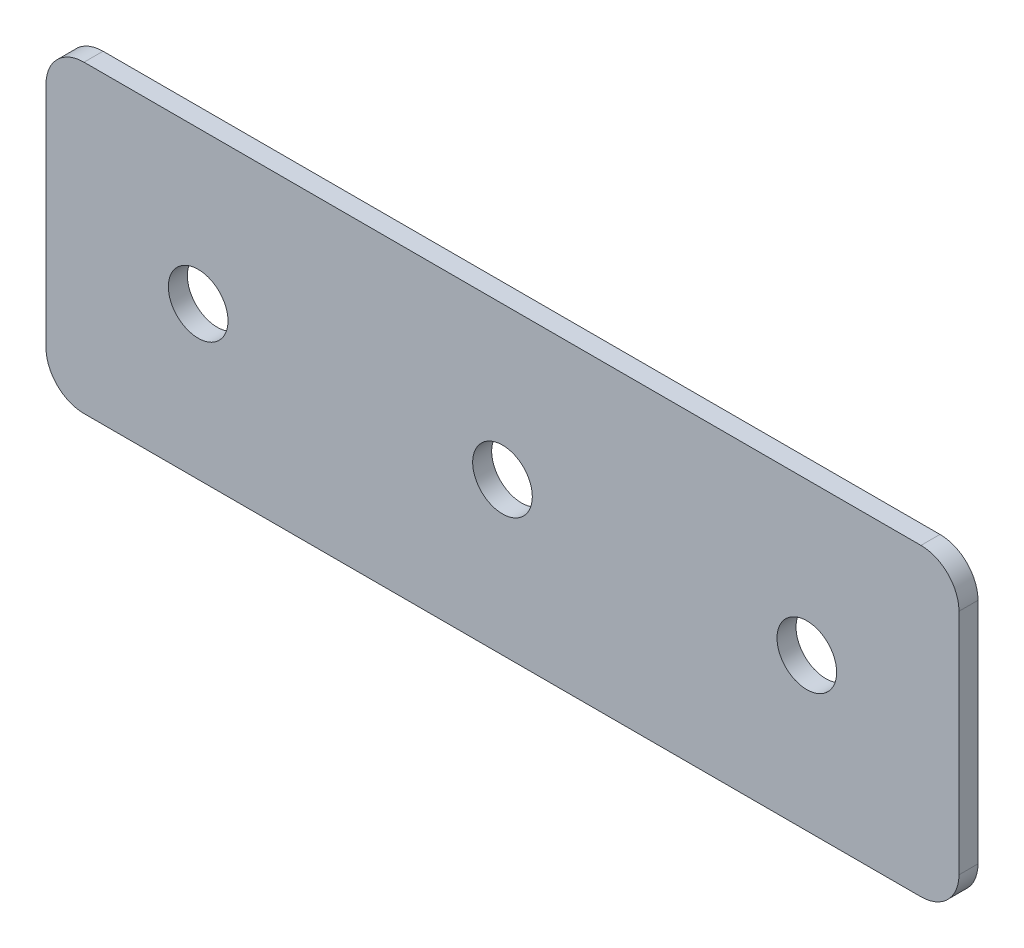
ISO-10303-21;
HEADER;
FILE_DESCRIPTION(('STEP AP214'),'2;1');
FILE_NAME('part.step','',(''),(''),'','','');
FILE_SCHEMA(('AUTOMOTIVE_DESIGN { 1 0 10303 214 1 1 1 1 }'));
ENDSEC;
DATA;
#1=APPLICATION_CONTEXT('core data for automotive mechanical design processes');
#2=APPLICATION_PROTOCOL_DEFINITION('international standard','automotive_design',2000,#1);
#3=PRODUCT_CONTEXT('',#1,'mechanical');
#4=PRODUCT('Part','Part','',(#3));
#5=PRODUCT_RELATED_PRODUCT_CATEGORY('part','',(#4));
#6=PRODUCT_DEFINITION_FORMATION('','',#4);
#7=PRODUCT_DEFINITION_CONTEXT('part definition',#1,'design');
#8=PRODUCT_DEFINITION('design','',#6,#7);
#9=PRODUCT_DEFINITION_SHAPE('','',#8);
#10=(LENGTH_UNIT() NAMED_UNIT(*) SI_UNIT(.MILLI.,.METRE.));
#11=(NAMED_UNIT(*) PLANE_ANGLE_UNIT() SI_UNIT($,.RADIAN.));
#12=(NAMED_UNIT(*) SI_UNIT($,.STERADIAN.) SOLID_ANGLE_UNIT());
#13=UNCERTAINTY_MEASURE_WITH_UNIT(LENGTH_MEASURE(1.E-05),#10,'distance_accuracy_value','');
#14=(GEOMETRIC_REPRESENTATION_CONTEXT(3) GLOBAL_UNCERTAINTY_ASSIGNED_CONTEXT((#13)) GLOBAL_UNIT_ASSIGNED_CONTEXT((#10,
#11,#12)) REPRESENTATION_CONTEXT('',''));
#15=CARTESIAN_POINT('',(0.,0.,0.));
#16=DIRECTION('',(0.,0.,1.));
#17=DIRECTION('',(1.,0.,0.));
#18=AXIS2_PLACEMENT_3D('',#15,#16,#17);
#19=CARTESIAN_POINT('',(0.,0.,-1.5875));
#20=DIRECTION('',(-1.,0.,0.));
#21=DIRECTION('',(0.,0.,1.));
#22=AXIS2_PLACEMENT_3D('',#19,#20,#21);
#23=PLANE('',#22);
#24=DIRECTION('',(0.,-1.,0.));
#25=VECTOR('',#24,1.);
#26=CARTESIAN_POINT('',(0.,0.,-1.5875));
#27=LINE('',#26,#25);
#28=CARTESIAN_POINT('',(0.,22.225,-1.5875));
#29=VERTEX_POINT('',#28);
#30=CARTESIAN_POINT('',(0.,3.175,-1.5875));
#31=VERTEX_POINT('',#30);
#32=EDGE_CURVE('E173',#29,#31,#27,.T.);
#33=ORIENTED_EDGE('',*,*,#32,.T.);
#34=DIRECTION('',(0.,0.,1.));
#35=VECTOR('',#34,1.);
#36=CARTESIAN_POINT('',(0.,3.175,-1.5875));
#37=LINE('',#36,#35);
#38=CARTESIAN_POINT('',(0.,3.175,0.));
#39=VERTEX_POINT('',#38);
#40=EDGE_CURVE('E120',#31,#39,#37,.T.);
#41=ORIENTED_EDGE('',*,*,#40,.T.);
#42=DIRECTION('',(0.,-1.,0.));
#43=VECTOR('',#42,1.);
#44=CARTESIAN_POINT('',(0.,0.,0.));
#45=LINE('',#44,#43);
#46=CARTESIAN_POINT('',(0.,22.225,0.));
#47=VERTEX_POINT('',#46);
#48=EDGE_CURVE('E112',#47,#39,#45,.T.);
#49=ORIENTED_EDGE('',*,*,#48,.F.);
#50=DIRECTION('',(0.,0.,1.));
#51=VECTOR('',#50,1.);
#52=CARTESIAN_POINT('',(0.,22.225,-1.5875));
#53=LINE('',#52,#51);
#54=EDGE_CURVE('E125',#47,#29,#53,.F.);
#55=ORIENTED_EDGE('',*,*,#54,.T.);
#56=EDGE_LOOP('',(#33,#41,#49,#55));
#57=FACE_BOUND('',#56,.T.);
#58=ADVANCED_FACE('F43',(#57),#23,.T.);
#59=CARTESIAN_POINT('',(0.,25.4,-1.5875));
#60=DIRECTION('',(0.,1.,0.));
#61=DIRECTION('',(0.,0.,1.));
#62=AXIS2_PLACEMENT_3D('',#59,#60,#61);
#63=PLANE('',#62);
#64=DIRECTION('',(-1.,0.,0.));
#65=VECTOR('',#64,1.);
#66=CARTESIAN_POINT('',(0.,25.4,0.));
#67=LINE('',#66,#65);
#68=CARTESIAN_POINT('',(73.025,25.4,0.));
#69=VERTEX_POINT('',#68);
#70=CARTESIAN_POINT('',(3.175,25.4,0.));
#71=VERTEX_POINT('',#70);
#72=EDGE_CURVE('E114',#69,#71,#67,.T.);
#73=ORIENTED_EDGE('',*,*,#72,.F.);
#74=DIRECTION('',(0.,0.,1.));
#75=VECTOR('',#74,1.);
#76=CARTESIAN_POINT('',(73.025,25.4,-1.5875));
#77=LINE('',#76,#75);
#78=CARTESIAN_POINT('',(73.025,25.4,-1.5875));
#79=VERTEX_POINT('',#78);
#80=EDGE_CURVE('E11',#69,#79,#77,.F.);
#81=ORIENTED_EDGE('',*,*,#80,.T.);
#82=DIRECTION('',(-1.,0.,0.));
#83=VECTOR('',#82,1.);
#84=CARTESIAN_POINT('',(0.,25.4,-1.5875));
#85=LINE('',#84,#83);
#86=CARTESIAN_POINT('',(3.175,25.4,-1.5875));
#87=VERTEX_POINT('',#86);
#88=EDGE_CURVE('E133',#79,#87,#85,.T.);
#89=ORIENTED_EDGE('',*,*,#88,.T.);
#90=DIRECTION('',(0.,0.,1.));
#91=VECTOR('',#90,1.);
#92=CARTESIAN_POINT('',(3.175,25.4,-1.5875));
#93=LINE('',#92,#91);
#94=EDGE_CURVE('E51',#87,#71,#93,.T.);
#95=ORIENTED_EDGE('',*,*,#94,.T.);
#96=EDGE_LOOP('',(#73,#81,#89,#95));
#97=FACE_BOUND('',#96,.T.);
#98=ADVANCED_FACE('F162',(#97),#63,.T.);
#99=CARTESIAN_POINT('',(76.2,0.,-1.5875));
#100=DIRECTION('',(1.,0.,0.));
#101=DIRECTION('',(0.,0.,-1.));
#102=AXIS2_PLACEMENT_3D('',#99,#100,#101);
#103=PLANE('',#102);
#104=DIRECTION('',(0.,1.,0.));
#105=VECTOR('',#104,1.);
#106=CARTESIAN_POINT('',(76.2,0.,0.));
#107=LINE('',#106,#105);
#108=CARTESIAN_POINT('',(76.2,3.175,0.));
#109=VERTEX_POINT('',#108);
#110=CARTESIAN_POINT('',(76.2,22.225,0.));
#111=VERTEX_POINT('',#110);
#112=EDGE_CURVE('E171',#109,#111,#107,.T.);
#113=ORIENTED_EDGE('',*,*,#112,.F.);
#114=DIRECTION('',(0.,0.,1.));
#115=VECTOR('',#114,1.);
#116=CARTESIAN_POINT('',(76.2,3.175,-1.5875));
#117=LINE('',#116,#115);
#118=CARTESIAN_POINT('',(76.2,3.175,-1.5875));
#119=VERTEX_POINT('',#118);
#120=EDGE_CURVE('E65',#109,#119,#117,.F.);
#121=ORIENTED_EDGE('',*,*,#120,.T.);
#122=DIRECTION('',(0.,1.,0.));
#123=VECTOR('',#122,1.);
#124=CARTESIAN_POINT('',(76.2,0.,-1.5875));
#125=LINE('',#124,#123);
#126=CARTESIAN_POINT('',(76.2,22.225,-1.5875));
#127=VERTEX_POINT('',#126);
#128=EDGE_CURVE('E137',#119,#127,#125,.T.);
#129=ORIENTED_EDGE('',*,*,#128,.T.);
#130=DIRECTION('',(0.,0.,1.));
#131=VECTOR('',#130,1.);
#132=CARTESIAN_POINT('',(76.2,22.225,-1.5875));
#133=LINE('',#132,#131);
#134=EDGE_CURVE('E158',#127,#111,#133,.T.);
#135=ORIENTED_EDGE('',*,*,#134,.T.);
#136=EDGE_LOOP('',(#113,#121,#129,#135));
#137=FACE_BOUND('',#136,.T.);
#138=ADVANCED_FACE('F170',(#137),#103,.T.);
#139=CARTESIAN_POINT('',(0.,0.,-1.5875));
#140=DIRECTION('',(0.,-1.,0.));
#141=DIRECTION('',(0.,0.,-1.));
#142=AXIS2_PLACEMENT_3D('',#139,#140,#141);
#143=PLANE('',#142);
#144=DIRECTION('',(1.,0.,0.));
#145=VECTOR('',#144,1.);
#146=CARTESIAN_POINT('',(0.,0.,0.));
#147=LINE('',#146,#145);
#148=CARTESIAN_POINT('',(3.175,0.,0.));
#149=VERTEX_POINT('',#148);
#150=CARTESIAN_POINT('',(73.025,0.,0.));
#151=VERTEX_POINT('',#150);
#152=EDGE_CURVE('E128',#149,#151,#147,.T.);
#153=ORIENTED_EDGE('',*,*,#152,.F.);
#154=DIRECTION('',(0.,0.,1.));
#155=VECTOR('',#154,1.);
#156=CARTESIAN_POINT('',(3.175,0.,-1.5875));
#157=LINE('',#156,#155);
#158=CARTESIAN_POINT('',(3.175,0.,-1.5875));
#159=VERTEX_POINT('',#158);
#160=EDGE_CURVE('E150',#149,#159,#157,.F.);
#161=ORIENTED_EDGE('',*,*,#160,.T.);
#162=DIRECTION('',(1.,0.,0.));
#163=VECTOR('',#162,1.);
#164=CARTESIAN_POINT('',(0.,0.,-1.5875));
#165=LINE('',#164,#163);
#166=CARTESIAN_POINT('',(73.025,0.,-1.5875));
#167=VERTEX_POINT('',#166);
#168=EDGE_CURVE('E177',#159,#167,#165,.T.);
#169=ORIENTED_EDGE('',*,*,#168,.T.);
#170=DIRECTION('',(0.,0.,1.));
#171=VECTOR('',#170,1.);
#172=CARTESIAN_POINT('',(73.025,0.,-1.5875));
#173=LINE('',#172,#171);
#174=EDGE_CURVE('E147',#167,#151,#173,.T.);
#175=ORIENTED_EDGE('',*,*,#174,.T.);
#176=EDGE_LOOP('',(#153,#161,#169,#175));
#177=FACE_BOUND('',#176,.T.);
#178=ADVANCED_FACE('F235',(#177),#143,.T.);
#179=CARTESIAN_POINT('',(0.,0.,-1.5875));
#180=DIRECTION('',(0.,0.,-1.));
#181=DIRECTION('',(-1.,0.,0.));
#182=AXIS2_PLACEMENT_3D('',#179,#180,#181);
#183=PLANE('',#182);
#184=CARTESIAN_POINT('',(12.7,12.7,-1.5875));
#185=DIRECTION('',(0.,0.,1.));
#186=DIRECTION('',(1.,0.,0.));
#187=AXIS2_PLACEMENT_3D('',#184,#185,#186);
#188=CIRCLE('',#187,2.4892);
#189=CARTESIAN_POINT('',(15.1892,12.7,-1.5875));
#190=VERTEX_POINT('',#189);
#191=EDGE_CURVE('E129',#190,#190,#188,.T.);
#192=ORIENTED_EDGE('',*,*,#191,.T.);
#193=EDGE_LOOP('',(#192));
#194=FACE_BOUND('',#193,.T.);
#195=CARTESIAN_POINT('',(38.1,12.7,-1.5875));
#196=DIRECTION('',(0.,0.,1.));
#197=DIRECTION('',(1.,0.,0.));
#198=AXIS2_PLACEMENT_3D('',#195,#196,#197);
#199=CIRCLE('',#198,2.4892);
#200=CARTESIAN_POINT('',(40.5892,12.7,-1.5875));
#201=VERTEX_POINT('',#200);
#202=EDGE_CURVE('E187',#201,#201,#199,.T.);
#203=ORIENTED_EDGE('',*,*,#202,.T.);
#204=EDGE_LOOP('',(#203));
#205=FACE_BOUND('',#204,.T.);
#206=CARTESIAN_POINT('',(63.5,12.7,-1.5875));
#207=DIRECTION('',(0.,0.,1.));
#208=DIRECTION('',(1.,0.,0.));
#209=AXIS2_PLACEMENT_3D('',#206,#207,#208);
#210=CIRCLE('',#209,2.4892);
#211=CARTESIAN_POINT('',(65.9892,12.7,-1.5875));
#212=VERTEX_POINT('',#211);
#213=EDGE_CURVE('E181',#212,#212,#210,.T.);
#214=ORIENTED_EDGE('',*,*,#213,.T.);
#215=EDGE_LOOP('',(#214));
#216=FACE_BOUND('',#215,.T.);
#217=ORIENTED_EDGE('',*,*,#168,.F.);
#218=CARTESIAN_POINT('',(3.175,3.175,-1.5875));
#219=DIRECTION('',(0.,0.,-1.));
#220=DIRECTION('',(-1.,0.,0.));
#221=AXIS2_PLACEMENT_3D('',#218,#219,#220);
#222=CIRCLE('',#221,3.175);
#223=EDGE_CURVE('E156',#159,#31,#222,.T.);
#224=ORIENTED_EDGE('',*,*,#223,.T.);
#225=ORIENTED_EDGE('',*,*,#32,.F.);
#226=CARTESIAN_POINT('',(3.175,22.225,-1.5875));
#227=DIRECTION('',(0.,0.,-1.));
#228=DIRECTION('',(-1.,0.,0.));
#229=AXIS2_PLACEMENT_3D('',#226,#227,#228);
#230=CIRCLE('',#229,3.175);
#231=EDGE_CURVE('E132',#29,#87,#230,.T.);
#232=ORIENTED_EDGE('',*,*,#231,.T.);
#233=ORIENTED_EDGE('',*,*,#88,.F.);
#234=CARTESIAN_POINT('',(73.025,22.225,-1.5875));
#235=DIRECTION('',(0.,0.,-1.));
#236=DIRECTION('',(-1.,0.,0.));
#237=AXIS2_PLACEMENT_3D('',#234,#235,#236);
#238=CIRCLE('',#237,3.175);
#239=EDGE_CURVE('E58',#79,#127,#238,.T.);
#240=ORIENTED_EDGE('',*,*,#239,.T.);
#241=ORIENTED_EDGE('',*,*,#128,.F.);
#242=CARTESIAN_POINT('',(73.025,3.175,-1.5875));
#243=DIRECTION('',(0.,0.,-1.));
#244=DIRECTION('',(-1.,0.,0.));
#245=AXIS2_PLACEMENT_3D('',#242,#243,#244);
#246=CIRCLE('',#245,3.175);
#247=EDGE_CURVE('E154',#119,#167,#246,.T.);
#248=ORIENTED_EDGE('',*,*,#247,.T.);
#249=EDGE_LOOP('',(#217,#224,#225,#232,#233,#240,#241,#248));
#250=FACE_BOUND('',#249,.T.);
#251=ADVANCED_FACE('F165',(#194,#205,#216,#250),#183,.T.);
#252=CARTESIAN_POINT('',(0.,0.,0.));
#253=DIRECTION('',(0.,0.,-1.));
#254=DIRECTION('',(-1.,0.,0.));
#255=AXIS2_PLACEMENT_3D('',#252,#253,#254);
#256=PLANE('',#255);
#257=CARTESIAN_POINT('',(12.7,12.7,0.));
#258=DIRECTION('',(0.,0.,1.));
#259=DIRECTION('',(1.,0.,0.));
#260=AXIS2_PLACEMENT_3D('',#257,#258,#259);
#261=CIRCLE('',#260,2.4892);
#262=CARTESIAN_POINT('',(15.1892,12.7,0.));
#263=VERTEX_POINT('',#262);
#264=EDGE_CURVE('E193',#263,#263,#261,.T.);
#265=ORIENTED_EDGE('',*,*,#264,.F.);
#266=EDGE_LOOP('',(#265));
#267=FACE_BOUND('',#266,.T.);
#268=CARTESIAN_POINT('',(38.1,12.7,0.));
#269=DIRECTION('',(0.,0.,1.));
#270=DIRECTION('',(1.,0.,0.));
#271=AXIS2_PLACEMENT_3D('',#268,#269,#270);
#272=CIRCLE('',#271,2.4892);
#273=CARTESIAN_POINT('',(40.5892,12.7,0.));
#274=VERTEX_POINT('',#273);
#275=EDGE_CURVE('E190',#274,#274,#272,.T.);
#276=ORIENTED_EDGE('',*,*,#275,.F.);
#277=EDGE_LOOP('',(#276));
#278=FACE_BOUND('',#277,.T.);
#279=CARTESIAN_POINT('',(63.5,12.7,0.));
#280=DIRECTION('',(0.,0.,1.));
#281=DIRECTION('',(1.,0.,0.));
#282=AXIS2_PLACEMENT_3D('',#279,#280,#281);
#283=CIRCLE('',#282,2.4892);
#284=CARTESIAN_POINT('',(65.9892,12.7,0.));
#285=VERTEX_POINT('',#284);
#286=EDGE_CURVE('E184',#285,#285,#283,.T.);
#287=ORIENTED_EDGE('',*,*,#286,.F.);
#288=EDGE_LOOP('',(#287));
#289=FACE_BOUND('',#288,.T.);
#290=ORIENTED_EDGE('',*,*,#48,.T.);
#291=CARTESIAN_POINT('',(3.175,3.175,0.));
#292=DIRECTION('',(0.,0.,-1.));
#293=DIRECTION('',(-1.,0.,0.));
#294=AXIS2_PLACEMENT_3D('',#291,#292,#293);
#295=CIRCLE('',#294,3.175);
#296=EDGE_CURVE('E145',#39,#149,#295,.F.);
#297=ORIENTED_EDGE('',*,*,#296,.T.);
#298=ORIENTED_EDGE('',*,*,#152,.T.);
#299=CARTESIAN_POINT('',(73.025,3.175,0.));
#300=DIRECTION('',(0.,0.,-1.));
#301=DIRECTION('',(-1.,0.,0.));
#302=AXIS2_PLACEMENT_3D('',#299,#300,#301);
#303=CIRCLE('',#302,3.175);
#304=EDGE_CURVE('E143',#151,#109,#303,.F.);
#305=ORIENTED_EDGE('',*,*,#304,.T.);
#306=ORIENTED_EDGE('',*,*,#112,.T.);
#307=CARTESIAN_POINT('',(73.025,22.225,0.));
#308=DIRECTION('',(0.,0.,-1.));
#309=DIRECTION('',(-1.,0.,0.));
#310=AXIS2_PLACEMENT_3D('',#307,#308,#309);
#311=CIRCLE('',#310,3.175);
#312=EDGE_CURVE('E119',#111,#69,#311,.F.);
#313=ORIENTED_EDGE('',*,*,#312,.T.);
#314=ORIENTED_EDGE('',*,*,#72,.T.);
#315=CARTESIAN_POINT('',(3.175,22.225,0.));
#316=DIRECTION('',(0.,0.,-1.));
#317=DIRECTION('',(-1.,0.,0.));
#318=AXIS2_PLACEMENT_3D('',#315,#316,#317);
#319=CIRCLE('',#318,3.175);
#320=EDGE_CURVE('E109',#71,#47,#319,.F.);
#321=ORIENTED_EDGE('',*,*,#320,.T.);
#322=EDGE_LOOP('',(#290,#297,#298,#305,#306,#313,#314,#321));
#323=FACE_BOUND('',#322,.T.);
#324=ADVANCED_FACE('F111',(#267,#278,#289,#323),#256,.F.);
#325=CARTESIAN_POINT('',(63.5,12.7,-1.5875));
#326=DIRECTION('',(0.,0.,1.));
#327=DIRECTION('',(1.,0.,0.));
#328=AXIS2_PLACEMENT_3D('',#325,#326,#327);
#329=CYLINDRICAL_SURFACE('',#328,2.4892);
#330=ORIENTED_EDGE('',*,*,#213,.F.);
#331=EDGE_LOOP('',(#330));
#332=FACE_BOUND('',#331,.T.);
#333=ORIENTED_EDGE('',*,*,#286,.T.);
#334=EDGE_LOOP('',(#333));
#335=FACE_BOUND('',#334,.T.);
#336=ADVANCED_FACE('F211',(#332,#335),#329,.F.);
#337=CARTESIAN_POINT('',(38.1,12.7,-1.5875));
#338=DIRECTION('',(0.,0.,1.));
#339=DIRECTION('',(1.,0.,0.));
#340=AXIS2_PLACEMENT_3D('',#337,#338,#339);
#341=CYLINDRICAL_SURFACE('',#340,2.4892);
#342=ORIENTED_EDGE('',*,*,#202,.F.);
#343=EDGE_LOOP('',(#342));
#344=FACE_BOUND('',#343,.T.);
#345=ORIENTED_EDGE('',*,*,#275,.T.);
#346=EDGE_LOOP('',(#345));
#347=FACE_BOUND('',#346,.T.);
#348=ADVANCED_FACE('F205',(#344,#347),#341,.F.);
#349=CARTESIAN_POINT('',(12.7,12.7,-1.5875));
#350=DIRECTION('',(0.,0.,1.));
#351=DIRECTION('',(1.,0.,0.));
#352=AXIS2_PLACEMENT_3D('',#349,#350,#351);
#353=CYLINDRICAL_SURFACE('',#352,2.4892);
#354=ORIENTED_EDGE('',*,*,#191,.F.);
#355=EDGE_LOOP('',(#354));
#356=FACE_BOUND('',#355,.T.);
#357=ORIENTED_EDGE('',*,*,#264,.T.);
#358=EDGE_LOOP('',(#357));
#359=FACE_BOUND('',#358,.T.);
#360=ADVANCED_FACE('F201',(#356,#359),#353,.F.);
#361=CARTESIAN_POINT('',(3.175,3.175,-1.5875));
#362=DIRECTION('',(0.,0.,1.));
#363=DIRECTION('',(1.,0.,0.));
#364=AXIS2_PLACEMENT_3D('',#361,#362,#363);
#365=CYLINDRICAL_SURFACE('',#364,3.175);
#366=ORIENTED_EDGE('',*,*,#223,.F.);
#367=ORIENTED_EDGE('',*,*,#160,.F.);
#368=ORIENTED_EDGE('',*,*,#296,.F.);
#369=ORIENTED_EDGE('',*,*,#40,.F.);
#370=EDGE_LOOP('',(#366,#367,#368,#369));
#371=FACE_BOUND('',#370,.T.);
#372=ADVANCED_FACE('F204',(#371),#365,.T.);
#373=CARTESIAN_POINT('',(73.025,3.175,-1.5875));
#374=DIRECTION('',(0.,0.,1.));
#375=DIRECTION('',(1.,0.,0.));
#376=AXIS2_PLACEMENT_3D('',#373,#374,#375);
#377=CYLINDRICAL_SURFACE('',#376,3.175);
#378=ORIENTED_EDGE('',*,*,#247,.F.);
#379=ORIENTED_EDGE('',*,*,#120,.F.);
#380=ORIENTED_EDGE('',*,*,#304,.F.);
#381=ORIENTED_EDGE('',*,*,#174,.F.);
#382=EDGE_LOOP('',(#378,#379,#380,#381));
#383=FACE_BOUND('',#382,.T.);
#384=ADVANCED_FACE('F239',(#383),#377,.T.);
#385=CARTESIAN_POINT('',(73.025,22.225,-1.5875));
#386=DIRECTION('',(0.,0.,1.));
#387=DIRECTION('',(1.,0.,0.));
#388=AXIS2_PLACEMENT_3D('',#385,#386,#387);
#389=CYLINDRICAL_SURFACE('',#388,3.175);
#390=ORIENTED_EDGE('',*,*,#239,.F.);
#391=ORIENTED_EDGE('',*,*,#80,.F.);
#392=ORIENTED_EDGE('',*,*,#312,.F.);
#393=ORIENTED_EDGE('',*,*,#134,.F.);
#394=EDGE_LOOP('',(#390,#391,#392,#393));
#395=FACE_BOUND('',#394,.T.);
#396=ADVANCED_FACE('F168',(#395),#389,.T.);
#397=CARTESIAN_POINT('',(3.175,22.225,-1.5875));
#398=DIRECTION('',(0.,0.,1.));
#399=DIRECTION('',(1.,0.,0.));
#400=AXIS2_PLACEMENT_3D('',#397,#398,#399);
#401=CYLINDRICAL_SURFACE('',#400,3.175);
#402=ORIENTED_EDGE('',*,*,#231,.F.);
#403=ORIENTED_EDGE('',*,*,#54,.F.);
#404=ORIENTED_EDGE('',*,*,#320,.F.);
#405=ORIENTED_EDGE('',*,*,#94,.F.);
#406=EDGE_LOOP('',(#402,#403,#404,#405));
#407=FACE_BOUND('',#406,.T.);
#408=ADVANCED_FACE('F45',(#407),#401,.T.);
#409=CLOSED_SHELL('',(#58,#98,#138,#178,#251,#324,#336,#348,#360,#372,#384,#396,#408));
#410=MANIFOLD_SOLID_BREP('B2',#409);
#411=ADVANCED_BREP_SHAPE_REPRESENTATION('',(#18,#410),#14);
#412=SHAPE_DEFINITION_REPRESENTATION(#9,#411);
ENDSEC;
END-ISO-10303-21;
